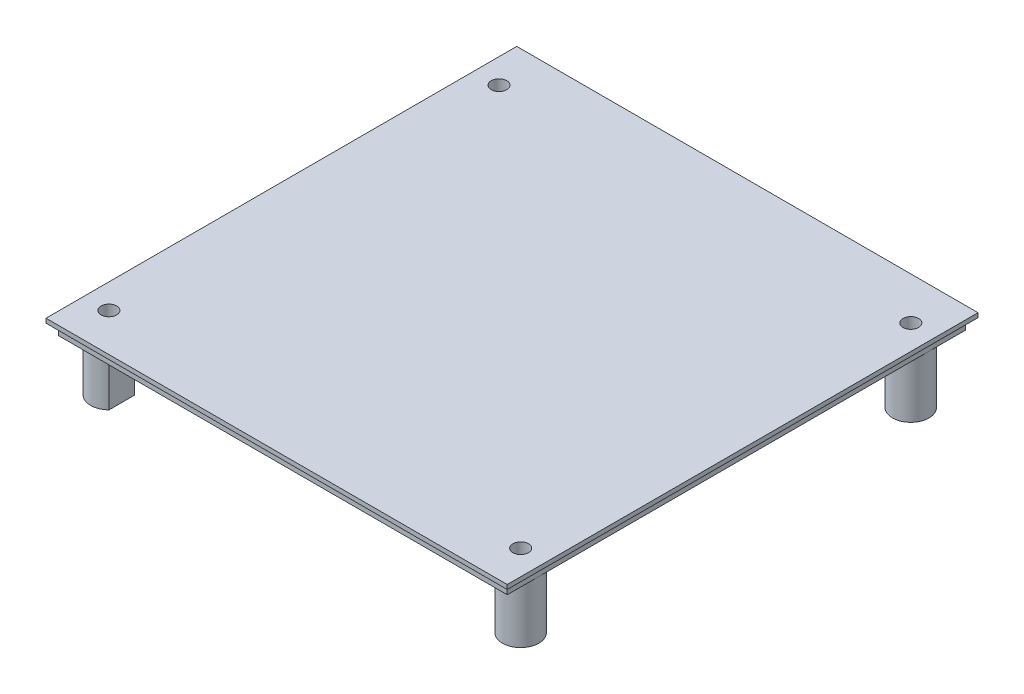
ISO-10303-21;
HEADER;
FILE_DESCRIPTION(('STEP AP214'),'2;1');
FILE_NAME('part.step','',(''),(''),'','','');
FILE_SCHEMA(('AUTOMOTIVE_DESIGN { 1 0 10303 214 1 1 1 1 }'));
ENDSEC;
DATA;
#1=APPLICATION_CONTEXT('core data for automotive mechanical design processes');
#2=APPLICATION_PROTOCOL_DEFINITION('international standard','automotive_design',2000,#1);
#3=PRODUCT_CONTEXT('',#1,'mechanical');
#4=PRODUCT('Part','Part','',(#3));
#5=PRODUCT_RELATED_PRODUCT_CATEGORY('part','',(#4));
#6=PRODUCT_DEFINITION_FORMATION('','',#4);
#7=PRODUCT_DEFINITION_CONTEXT('part definition',#1,'design');
#8=PRODUCT_DEFINITION('design','',#6,#7);
#9=PRODUCT_DEFINITION_SHAPE('','',#8);
#10=(LENGTH_UNIT() NAMED_UNIT(*) SI_UNIT(.MILLI.,.METRE.));
#11=(NAMED_UNIT(*) PLANE_ANGLE_UNIT() SI_UNIT($,.RADIAN.));
#12=(NAMED_UNIT(*) SI_UNIT($,.STERADIAN.) SOLID_ANGLE_UNIT());
#13=UNCERTAINTY_MEASURE_WITH_UNIT(LENGTH_MEASURE(1.E-05),#10,'distance_accuracy_value','');
#14=(GEOMETRIC_REPRESENTATION_CONTEXT(3) GLOBAL_UNCERTAINTY_ASSIGNED_CONTEXT((#13)) GLOBAL_UNIT_ASSIGNED_CONTEXT((#10,
#11,#12)) REPRESENTATION_CONTEXT('',''));
#15=CARTESIAN_POINT('',(0.,0.,0.));
#16=DIRECTION('',(0.,0.,1.));
#17=DIRECTION('',(1.,0.,0.));
#18=AXIS2_PLACEMENT_3D('',#15,#16,#17);
#19=CARTESIAN_POINT('',(0.,0.,0.));
#20=DIRECTION('',(0.,1.,0.));
#21=DIRECTION('',(0.,0.,1.));
#22=AXIS2_PLACEMENT_3D('',#19,#20,#21);
#23=PLANE('',#22);
#24=DIRECTION('',(0.,0.,-1.));
#25=VECTOR('',#24,1.);
#26=CARTESIAN_POINT('',(-44.5,0.,50.724603037412));
#27=LINE('',#26,#25);
#28=CARTESIAN_POINT('',(-44.5,0.,-41.5606123086612));
#29=VERTEX_POINT('',#28);
#30=CARTESIAN_POINT('',(-44.5,0.,-47.4393876913388));
#31=VERTEX_POINT('',#30);
#32=EDGE_CURVE('E445',#29,#31,#27,.T.);
#33=ORIENTED_EDGE('',*,*,#32,.T.);
#34=CARTESIAN_POINT('',(-47.500000000001,0.,-44.5));
#35=DIRECTION('',(0.,-1.,0.));
#36=DIRECTION('',(0.,0.,-1.));
#37=AXIS2_PLACEMENT_3D('',#34,#35,#36);
#38=CIRCLE('',#37,4.2);
#39=CARTESIAN_POINT('',(-51.05,0.,-46.744437568748));
#40=VERTEX_POINT('',#39);
#41=EDGE_CURVE('E268',#40,#31,#38,.T.);
#42=ORIENTED_EDGE('',*,*,#41,.F.);
#43=DIRECTION('',(0.,0.,-1.));
#44=VECTOR('',#43,1.);
#45=CARTESIAN_POINT('',(-51.05,0.,52.15));
#46=LINE('',#45,#44);
#47=CARTESIAN_POINT('',(-51.05,0.,-52.15));
#48=VERTEX_POINT('',#47);
#49=EDGE_CURVE('E343',#40,#48,#46,.T.);
#50=ORIENTED_EDGE('',*,*,#49,.T.);
#51=DIRECTION('',(1.,0.,0.));
#52=VECTOR('',#51,1.);
#53=CARTESIAN_POINT('',(-51.05,0.,-52.15));
#54=LINE('',#53,#52);
#55=CARTESIAN_POINT('',(51.05,0.,-52.15));
#56=VERTEX_POINT('',#55);
#57=EDGE_CURVE('E318',#48,#56,#54,.T.);
#58=ORIENTED_EDGE('',*,*,#57,.T.);
#59=DIRECTION('',(0.,0.,1.));
#60=VECTOR('',#59,1.);
#61=CARTESIAN_POINT('',(51.05,0.,-52.15));
#62=LINE('',#61,#60);
#63=CARTESIAN_POINT('',(51.05,0.,-46.7444375687459));
#64=VERTEX_POINT('',#63);
#65=EDGE_CURVE('E246',#56,#64,#62,.T.);
#66=ORIENTED_EDGE('',*,*,#65,.T.);
#67=CARTESIAN_POINT('',(47.4999999999997,0.,-44.5));
#68=DIRECTION('',(0.,-1.,0.));
#69=DIRECTION('',(0.,0.,-1.));
#70=AXIS2_PLACEMENT_3D('',#67,#68,#69);
#71=CIRCLE('',#70,4.2);
#72=CARTESIAN_POINT('',(44.5,0.,-47.4393876913401));
#73=VERTEX_POINT('',#72);
#74=EDGE_CURVE('E238',#73,#64,#71,.T.);
#75=ORIENTED_EDGE('',*,*,#74,.F.);
#76=DIRECTION('',(0.,0.,1.));
#77=VECTOR('',#76,1.);
#78=CARTESIAN_POINT('',(44.5,0.,50.724603037412));
#79=LINE('',#78,#77);
#80=CARTESIAN_POINT('',(44.5,0.,-41.5606123086599));
#81=VERTEX_POINT('',#80);
#82=EDGE_CURVE('E221',#73,#81,#79,.T.);
#83=ORIENTED_EDGE('',*,*,#82,.T.);
#84=CARTESIAN_POINT('',(51.05,0.,-42.2555624312541));
#85=VERTEX_POINT('',#84);
#86=EDGE_CURVE('E247',#85,#81,#71,.T.);
#87=ORIENTED_EDGE('',*,*,#86,.F.);
#88=CARTESIAN_POINT('',(51.05,0.,43.2555624312541));
#89=VERTEX_POINT('',#88);
#90=EDGE_CURVE('E340',#85,#89,#62,.T.);
#91=ORIENTED_EDGE('',*,*,#90,.T.);
#92=CARTESIAN_POINT('',(47.4999999999997,0.,45.5));
#93=DIRECTION('',(0.,-1.,0.));
#94=DIRECTION('',(0.,0.,-1.));
#95=AXIS2_PLACEMENT_3D('',#92,#93,#94);
#96=CIRCLE('',#95,4.2);
#97=CARTESIAN_POINT('',(44.5,0.,42.5606123086599));
#98=VERTEX_POINT('',#97);
#99=EDGE_CURVE('E279',#98,#89,#96,.T.);
#100=ORIENTED_EDGE('',*,*,#99,.F.);
#101=CARTESIAN_POINT('',(44.5,0.,48.4393876913401));
#102=VERTEX_POINT('',#101);
#103=EDGE_CURVE('E233',#98,#102,#79,.T.);
#104=ORIENTED_EDGE('',*,*,#103,.T.);
#105=CARTESIAN_POINT('',(51.05,0.,47.7444375687459));
#106=VERTEX_POINT('',#105);
#107=EDGE_CURVE('E284',#106,#102,#96,.T.);
#108=ORIENTED_EDGE('',*,*,#107,.F.);
#109=CARTESIAN_POINT('',(51.05,0.,52.15));
#110=VERTEX_POINT('',#109);
#111=EDGE_CURVE('E337',#106,#110,#62,.T.);
#112=ORIENTED_EDGE('',*,*,#111,.T.);
#113=DIRECTION('',(-1.,0.,0.));
#114=VECTOR('',#113,1.);
#115=CARTESIAN_POINT('',(51.05,0.,52.15));
#116=LINE('',#115,#114);
#117=CARTESIAN_POINT('',(-51.05,0.,52.15));
#118=VERTEX_POINT('',#117);
#119=EDGE_CURVE('E339',#110,#118,#116,.T.);
#120=ORIENTED_EDGE('',*,*,#119,.T.);
#121=CARTESIAN_POINT('',(-51.05,0.,47.744437568748));
#122=VERTEX_POINT('',#121);
#123=EDGE_CURVE('E322',#118,#122,#46,.T.);
#124=ORIENTED_EDGE('',*,*,#123,.T.);
#125=CARTESIAN_POINT('',(-47.500000000001,0.,45.5));
#126=DIRECTION('',(0.,-1.,0.));
#127=DIRECTION('',(0.,0.,-1.));
#128=AXIS2_PLACEMENT_3D('',#125,#126,#127);
#129=CIRCLE('',#128,4.2);
#130=CARTESIAN_POINT('',(-44.5,0.,48.4393876913387));
#131=VERTEX_POINT('',#130);
#132=EDGE_CURVE('E292',#131,#122,#129,.T.);
#133=ORIENTED_EDGE('',*,*,#132,.F.);
#134=CARTESIAN_POINT('',(-44.5,0.,42.5606123086612));
#135=VERTEX_POINT('',#134);
#136=EDGE_CURVE('E449',#131,#135,#27,.T.);
#137=ORIENTED_EDGE('',*,*,#136,.T.);
#138=CARTESIAN_POINT('',(-51.05,0.,43.255562431252));
#139=VERTEX_POINT('',#138);
#140=EDGE_CURVE('E297',#139,#135,#129,.T.);
#141=ORIENTED_EDGE('',*,*,#140,.F.);
#142=CARTESIAN_POINT('',(-51.05,0.,-42.255562431252));
#143=VERTEX_POINT('',#142);
#144=EDGE_CURVE('E346',#139,#143,#46,.T.);
#145=ORIENTED_EDGE('',*,*,#144,.T.);
#146=EDGE_CURVE('E263',#29,#143,#38,.T.);
#147=ORIENTED_EDGE('',*,*,#146,.F.);
#148=EDGE_LOOP('',(#33,#42,#50,#58,#66,#75,#83,#87,#91,#100,#104,#108,#112,#120,#124,#133,#137,
#141,#145,#147));
#149=FACE_BOUND('',#148,.T.);
#150=ADVANCED_FACE('F37',(#149),#23,.F.);
#151=CARTESIAN_POINT('',(51.05,-2.5,-52.15));
#152=DIRECTION('',(-1.,0.,0.));
#153=DIRECTION('',(0.,0.,1.));
#154=AXIS2_PLACEMENT_3D('',#151,#152,#153);
#155=PLANE('',#154);
#156=ORIENTED_EDGE('',*,*,#90,.F.);
#157=DIRECTION('',(0.,1.,0.));
#158=VECTOR('',#157,1.);
#159=CARTESIAN_POINT('',(51.05,-15.89,-42.2555624312541));
#160=LINE('',#159,#158);
#161=CARTESIAN_POINT('',(51.05,-2.5,-42.2555624312541));
#162=VERTEX_POINT('',#161);
#163=EDGE_CURVE('E257',#85,#162,#160,.F.);
#164=ORIENTED_EDGE('',*,*,#163,.T.);
#165=DIRECTION('',(0.,0.,1.));
#166=VECTOR('',#165,1.);
#167=CARTESIAN_POINT('',(51.05,-2.5,-52.15));
#168=LINE('',#167,#166);
#169=CARTESIAN_POINT('',(51.05,-2.5,43.2555624312541));
#170=VERTEX_POINT('',#169);
#171=EDGE_CURVE('E327',#162,#170,#168,.T.);
#172=ORIENTED_EDGE('',*,*,#171,.T.);
#173=DIRECTION('',(0.,1.,0.));
#174=VECTOR('',#173,1.);
#175=CARTESIAN_POINT('',(51.05,-15.89,43.2555624312541));
#176=LINE('',#175,#174);
#177=EDGE_CURVE('E420',#170,#89,#176,.T.);
#178=ORIENTED_EDGE('',*,*,#177,.T.);
#179=EDGE_LOOP('',(#156,#164,#172,#178));
#180=FACE_BOUND('',#179,.T.);
#181=ADVANCED_FACE('F508',(#180),#155,.T.);
#182=CARTESIAN_POINT('',(51.05,-2.5,-52.15));
#183=VERTEX_POINT('',#182);
#184=CARTESIAN_POINT('',(51.05,-2.5,-46.7444375687459));
#185=VERTEX_POINT('',#184);
#186=EDGE_CURVE('E323',#183,#185,#168,.T.);
#187=ORIENTED_EDGE('',*,*,#186,.T.);
#188=DIRECTION('',(0.,1.,0.));
#189=VECTOR('',#188,1.);
#190=CARTESIAN_POINT('',(51.05,-15.89,-46.7444375687459));
#191=LINE('',#190,#189);
#192=EDGE_CURVE('E255',#185,#64,#191,.T.);
#193=ORIENTED_EDGE('',*,*,#192,.T.);
#194=ORIENTED_EDGE('',*,*,#65,.F.);
#195=DIRECTION('',(0.,1.,0.));
#196=VECTOR('',#195,1.);
#197=CARTESIAN_POINT('',(51.05,-2.5,-52.15));
#198=LINE('',#197,#196);
#199=EDGE_CURVE('E354',#183,#56,#198,.T.);
#200=ORIENTED_EDGE('',*,*,#199,.F.);
#201=EDGE_LOOP('',(#187,#193,#194,#200));
#202=FACE_BOUND('',#201,.T.);
#203=ADVANCED_FACE('F490',(#202),#155,.T.);
#204=CARTESIAN_POINT('',(-51.05,-2.5,52.15));
#205=DIRECTION('',(1.,0.,0.));
#206=DIRECTION('',(0.,0.,-1.));
#207=AXIS2_PLACEMENT_3D('',#204,#205,#206);
#208=PLANE('',#207);
#209=ORIENTED_EDGE('',*,*,#49,.F.);
#210=DIRECTION('',(0.,1.,0.));
#211=VECTOR('',#210,1.);
#212=CARTESIAN_POINT('',(-51.05,-15.89,-46.744437568748));
#213=LINE('',#212,#211);
#214=CARTESIAN_POINT('',(-51.05,-2.5,-46.744437568748));
#215=VERTEX_POINT('',#214);
#216=EDGE_CURVE('E273',#40,#215,#213,.F.);
#217=ORIENTED_EDGE('',*,*,#216,.T.);
#218=DIRECTION('',(0.,0.,-1.));
#219=VECTOR('',#218,1.);
#220=CARTESIAN_POINT('',(-51.05,-2.5,52.15));
#221=LINE('',#220,#219);
#222=CARTESIAN_POINT('',(-51.05,-2.5,-52.15));
#223=VERTEX_POINT('',#222);
#224=EDGE_CURVE('E330',#215,#223,#221,.T.);
#225=ORIENTED_EDGE('',*,*,#224,.T.);
#226=DIRECTION('',(0.,1.,0.));
#227=VECTOR('',#226,1.);
#228=CARTESIAN_POINT('',(-51.05,-2.5,-52.15));
#229=LINE('',#228,#227);
#230=EDGE_CURVE('E334',#223,#48,#229,.T.);
#231=ORIENTED_EDGE('',*,*,#230,.T.);
#232=EDGE_LOOP('',(#209,#217,#225,#231));
#233=FACE_BOUND('',#232,.T.);
#234=ADVANCED_FACE('F482',(#233),#208,.T.);
#235=CARTESIAN_POINT('',(-51.05,-2.5,43.255562431252));
#236=VERTEX_POINT('',#235);
#237=CARTESIAN_POINT('',(-51.05,-2.5,-42.255562431252));
#238=VERTEX_POINT('',#237);
#239=EDGE_CURVE('E335',#236,#238,#221,.T.);
#240=ORIENTED_EDGE('',*,*,#239,.T.);
#241=DIRECTION('',(0.,1.,0.));
#242=VECTOR('',#241,1.);
#243=CARTESIAN_POINT('',(-51.05,-15.89,-42.255562431252));
#244=LINE('',#243,#242);
#245=EDGE_CURVE('E267',#238,#143,#244,.T.);
#246=ORIENTED_EDGE('',*,*,#245,.T.);
#247=ORIENTED_EDGE('',*,*,#144,.F.);
#248=DIRECTION('',(0.,1.,0.));
#249=VECTOR('',#248,1.);
#250=CARTESIAN_POINT('',(-51.05,-15.89,43.255562431252));
#251=LINE('',#250,#249);
#252=EDGE_CURVE('E304',#139,#236,#251,.F.);
#253=ORIENTED_EDGE('',*,*,#252,.T.);
#254=EDGE_LOOP('',(#240,#246,#247,#253));
#255=FACE_BOUND('',#254,.T.);
#256=ADVANCED_FACE('F494',(#255),#208,.T.);
#257=ORIENTED_EDGE('',*,*,#111,.F.);
#258=DIRECTION('',(0.,1.,0.));
#259=VECTOR('',#258,1.);
#260=CARTESIAN_POINT('',(51.05,-15.89,47.7444375687459));
#261=LINE('',#260,#259);
#262=CARTESIAN_POINT('',(51.05,-2.5,47.7444375687459));
#263=VERTEX_POINT('',#262);
#264=EDGE_CURVE('E423',#106,#263,#261,.F.);
#265=ORIENTED_EDGE('',*,*,#264,.T.);
#266=CARTESIAN_POINT('',(51.05,-2.5,52.15));
#267=VERTEX_POINT('',#266);
#268=EDGE_CURVE('E321',#263,#267,#168,.T.);
#269=ORIENTED_EDGE('',*,*,#268,.T.);
#270=DIRECTION('',(0.,1.,0.));
#271=VECTOR('',#270,1.);
#272=CARTESIAN_POINT('',(51.05,-2.5,52.15));
#273=LINE('',#272,#271);
#274=EDGE_CURVE('E351',#267,#110,#273,.T.);
#275=ORIENTED_EDGE('',*,*,#274,.T.);
#276=EDGE_LOOP('',(#257,#265,#269,#275));
#277=FACE_BOUND('',#276,.T.);
#278=ADVANCED_FACE('F516',(#277),#155,.T.);
#279=CARTESIAN_POINT('',(-51.05,-2.5,52.15));
#280=VERTEX_POINT('',#279);
#281=CARTESIAN_POINT('',(-51.05,-2.5,47.744437568748));
#282=VERTEX_POINT('',#281);
#283=EDGE_CURVE('E331',#280,#282,#221,.T.);
#284=ORIENTED_EDGE('',*,*,#283,.T.);
#285=DIRECTION('',(0.,1.,0.));
#286=VECTOR('',#285,1.);
#287=CARTESIAN_POINT('',(-51.05,-15.89,47.744437568748));
#288=LINE('',#287,#286);
#289=EDGE_CURVE('E296',#282,#122,#288,.T.);
#290=ORIENTED_EDGE('',*,*,#289,.T.);
#291=ORIENTED_EDGE('',*,*,#123,.F.);
#292=DIRECTION('',(0.,1.,0.));
#293=VECTOR('',#292,1.);
#294=CARTESIAN_POINT('',(-51.05,-2.5,52.15));
#295=LINE('',#294,#293);
#296=EDGE_CURVE('E349',#280,#118,#295,.T.);
#297=ORIENTED_EDGE('',*,*,#296,.F.);
#298=EDGE_LOOP('',(#284,#290,#291,#297));
#299=FACE_BOUND('',#298,.T.);
#300=ADVANCED_FACE('F467',(#299),#208,.T.);
#301=DIRECTION('',(0.,0.,-1.));
#302=VECTOR('',#301,1.);
#303=CARTESIAN_POINT('',(53.2,0.,-54.3));
#304=LINE('',#303,#302);
#305=CARTESIAN_POINT('',(53.2,0.,54.3));
#306=VERTEX_POINT('',#305);
#307=CARTESIAN_POINT('',(53.2,0.,-54.3));
#308=VERTEX_POINT('',#307);
#309=EDGE_CURVE('E390',#306,#308,#304,.T.);
#310=ORIENTED_EDGE('',*,*,#309,.F.);
#311=DIRECTION('',(1.,0.,0.));
#312=VECTOR('',#311,1.);
#313=CARTESIAN_POINT('',(-53.2,0.,54.3));
#314=LINE('',#313,#312);
#315=CARTESIAN_POINT('',(-53.2,0.,54.3));
#316=VERTEX_POINT('',#315);
#317=EDGE_CURVE('E395',#316,#306,#314,.T.);
#318=ORIENTED_EDGE('',*,*,#317,.F.);
#319=DIRECTION('',(0.,0.,1.));
#320=VECTOR('',#319,1.);
#321=CARTESIAN_POINT('',(-53.2,0.,-54.3));
#322=LINE('',#321,#320);
#323=CARTESIAN_POINT('',(-53.2,0.,-54.3));
#324=VERTEX_POINT('',#323);
#325=EDGE_CURVE('E406',#324,#316,#322,.T.);
#326=ORIENTED_EDGE('',*,*,#325,.F.);
#327=DIRECTION('',(-1.,0.,0.));
#328=VECTOR('',#327,1.);
#329=CARTESIAN_POINT('',(-53.2,0.,-54.3));
#330=LINE('',#329,#328);
#331=EDGE_CURVE('E404',#308,#324,#330,.T.);
#332=ORIENTED_EDGE('',*,*,#331,.F.);
#333=EDGE_LOOP('',(#310,#318,#326,#332));
#334=FACE_BOUND('',#333,.T.);
#335=DIRECTION('',(1.,0.,0.));
#336=VECTOR('',#335,1.);
#337=CARTESIAN_POINT('',(-51.75,0.,-52.85));
#338=LINE('',#337,#336);
#339=CARTESIAN_POINT('',(-51.75,0.,-52.85));
#340=VERTEX_POINT('',#339);
#341=CARTESIAN_POINT('',(51.75,0.,-52.85));
#342=VERTEX_POINT('',#341);
#343=EDGE_CURVE('E357',#340,#342,#338,.T.);
#344=ORIENTED_EDGE('',*,*,#343,.F.);
#345=DIRECTION('',(0.,0.,-1.));
#346=VECTOR('',#345,1.);
#347=CARTESIAN_POINT('',(-51.75,0.,52.85));
#348=LINE('',#347,#346);
#349=CARTESIAN_POINT('',(-51.75,0.,52.85));
#350=VERTEX_POINT('',#349);
#351=EDGE_CURVE('E362',#350,#340,#348,.T.);
#352=ORIENTED_EDGE('',*,*,#351,.F.);
#353=DIRECTION('',(-1.,0.,0.));
#354=VECTOR('',#353,1.);
#355=CARTESIAN_POINT('',(51.75,0.,52.85));
#356=LINE('',#355,#354);
#357=CARTESIAN_POINT('',(51.75,0.,52.85));
#358=VERTEX_POINT('',#357);
#359=EDGE_CURVE('E374',#358,#350,#356,.T.);
#360=ORIENTED_EDGE('',*,*,#359,.F.);
#361=DIRECTION('',(0.,0.,1.));
#362=VECTOR('',#361,1.);
#363=CARTESIAN_POINT('',(51.75,0.,-52.85));
#364=LINE('',#363,#362);
#365=EDGE_CURVE('E371',#342,#358,#364,.T.);
#366=ORIENTED_EDGE('',*,*,#365,.F.);
#367=EDGE_LOOP('',(#344,#352,#360,#366));
#368=FACE_BOUND('',#367,.T.);
#369=ADVANCED_FACE('F510',(#334,#368),#23,.F.);
#370=CARTESIAN_POINT('',(53.2,1.,-54.3));
#371=DIRECTION('',(-1.,0.,0.));
#372=DIRECTION('',(0.,0.,1.));
#373=AXIS2_PLACEMENT_3D('',#370,#371,#372);
#374=PLANE('',#373);
#375=ORIENTED_EDGE('',*,*,#309,.T.);
#376=DIRECTION('',(0.,-1.,0.));
#377=VECTOR('',#376,1.);
#378=CARTESIAN_POINT('',(53.2,1.,-54.3));
#379=LINE('',#378,#377);
#380=CARTESIAN_POINT('',(53.2,1.,-54.3));
#381=VERTEX_POINT('',#380);
#382=EDGE_CURVE('E417',#381,#308,#379,.T.);
#383=ORIENTED_EDGE('',*,*,#382,.F.);
#384=DIRECTION('',(0.,0.,-1.));
#385=VECTOR('',#384,1.);
#386=CARTESIAN_POINT('',(53.2,1.,-54.3));
#387=LINE('',#386,#385);
#388=CARTESIAN_POINT('',(53.2,1.,54.3));
#389=VERTEX_POINT('',#388);
#390=EDGE_CURVE('E391',#389,#381,#387,.T.);
#391=ORIENTED_EDGE('',*,*,#390,.F.);
#392=DIRECTION('',(0.,-1.,0.));
#393=VECTOR('',#392,1.);
#394=CARTESIAN_POINT('',(53.2,1.,54.3));
#395=LINE('',#394,#393);
#396=EDGE_CURVE('E401',#389,#306,#395,.T.);
#397=ORIENTED_EDGE('',*,*,#396,.T.);
#398=EDGE_LOOP('',(#375,#383,#391,#397));
#399=FACE_BOUND('',#398,.T.);
#400=ADVANCED_FACE('F39',(#399),#374,.F.);
#401=CARTESIAN_POINT('',(-53.2,1.,-54.3));
#402=DIRECTION('',(0.,0.,1.));
#403=DIRECTION('',(1.,0.,0.));
#404=AXIS2_PLACEMENT_3D('',#401,#402,#403);
#405=PLANE('',#404);
#406=ORIENTED_EDGE('',*,*,#331,.T.);
#407=DIRECTION('',(0.,-1.,0.));
#408=VECTOR('',#407,1.);
#409=CARTESIAN_POINT('',(-53.2,1.,-54.3));
#410=LINE('',#409,#408);
#411=CARTESIAN_POINT('',(-53.2,1.,-54.3));
#412=VERTEX_POINT('',#411);
#413=EDGE_CURVE('E414',#412,#324,#410,.T.);
#414=ORIENTED_EDGE('',*,*,#413,.F.);
#415=DIRECTION('',(-1.,0.,0.));
#416=VECTOR('',#415,1.);
#417=CARTESIAN_POINT('',(-53.2,1.,-54.3));
#418=LINE('',#417,#416);
#419=EDGE_CURVE('E394',#381,#412,#418,.T.);
#420=ORIENTED_EDGE('',*,*,#419,.F.);
#421=ORIENTED_EDGE('',*,*,#382,.T.);
#422=EDGE_LOOP('',(#406,#414,#420,#421));
#423=FACE_BOUND('',#422,.T.);
#424=ADVANCED_FACE('F525',(#423),#405,.F.);
#425=CARTESIAN_POINT('',(-53.2,1.,-54.3));
#426=DIRECTION('',(1.,0.,0.));
#427=DIRECTION('',(0.,0.,-1.));
#428=AXIS2_PLACEMENT_3D('',#425,#426,#427);
#429=PLANE('',#428);
#430=ORIENTED_EDGE('',*,*,#325,.T.);
#431=DIRECTION('',(0.,-1.,0.));
#432=VECTOR('',#431,1.);
#433=CARTESIAN_POINT('',(-53.2,1.,54.3));
#434=LINE('',#433,#432);
#435=CARTESIAN_POINT('',(-53.2,1.,54.3));
#436=VERTEX_POINT('',#435);
#437=EDGE_CURVE('E411',#436,#316,#434,.T.);
#438=ORIENTED_EDGE('',*,*,#437,.F.);
#439=DIRECTION('',(0.,0.,1.));
#440=VECTOR('',#439,1.);
#441=CARTESIAN_POINT('',(-53.2,1.,-54.3));
#442=LINE('',#441,#440);
#443=EDGE_CURVE('E397',#412,#436,#442,.T.);
#444=ORIENTED_EDGE('',*,*,#443,.F.);
#445=ORIENTED_EDGE('',*,*,#413,.T.);
#446=EDGE_LOOP('',(#430,#438,#444,#445));
#447=FACE_BOUND('',#446,.T.);
#448=ADVANCED_FACE('F565',(#447),#429,.F.);
#449=CARTESIAN_POINT('',(-53.2,1.,54.3));
#450=DIRECTION('',(0.,0.,-1.));
#451=DIRECTION('',(-1.,0.,0.));
#452=AXIS2_PLACEMENT_3D('',#449,#450,#451);
#453=PLANE('',#452);
#454=ORIENTED_EDGE('',*,*,#317,.T.);
#455=ORIENTED_EDGE('',*,*,#396,.F.);
#456=DIRECTION('',(1.,0.,0.));
#457=VECTOR('',#456,1.);
#458=CARTESIAN_POINT('',(-53.2,1.,54.3));
#459=LINE('',#458,#457);
#460=EDGE_CURVE('E399',#436,#389,#459,.T.);
#461=ORIENTED_EDGE('',*,*,#460,.F.);
#462=ORIENTED_EDGE('',*,*,#437,.T.);
#463=EDGE_LOOP('',(#454,#455,#461,#462));
#464=FACE_BOUND('',#463,.T.);
#465=ADVANCED_FACE('F558',(#464),#453,.F.);
#466=CARTESIAN_POINT('',(0.,1.,0.));
#467=DIRECTION('',(0.,1.,0.));
#468=DIRECTION('',(0.,0.,1.));
#469=AXIS2_PLACEMENT_3D('',#466,#467,#468);
#470=PLANE('',#469);
#471=CARTESIAN_POINT('',(47.4999999999997,1.,45.5));
#472=DIRECTION('',(0.,1.,0.));
#473=DIRECTION('',(0.,0.,1.));
#474=AXIS2_PLACEMENT_3D('',#471,#472,#473);
#475=CIRCLE('',#474,1.8);
#476=CARTESIAN_POINT('',(47.4999999999997,1.,47.3));
#477=VERTEX_POINT('',#476);
#478=EDGE_CURVE('E306',#477,#477,#475,.T.);
#479=ORIENTED_EDGE('',*,*,#478,.F.);
#480=EDGE_LOOP('',(#479));
#481=FACE_BOUND('',#480,.T.);
#482=CARTESIAN_POINT('',(-47.500000000001,1.,45.5));
#483=DIRECTION('',(0.,1.,0.));
#484=DIRECTION('',(0.,0.,1.));
#485=AXIS2_PLACEMENT_3D('',#482,#483,#484);
#486=CIRCLE('',#485,1.79999999999996);
#487=CARTESIAN_POINT('',(-47.500000000001,1.,47.2999999999999));
#488=VERTEX_POINT('',#487);
#489=EDGE_CURVE('E311',#488,#488,#486,.T.);
#490=ORIENTED_EDGE('',*,*,#489,.F.);
#491=EDGE_LOOP('',(#490));
#492=FACE_BOUND('',#491,.T.);
#493=CARTESIAN_POINT('',(-47.500000000001,1.,-44.5));
#494=DIRECTION('',(0.,1.,0.));
#495=DIRECTION('',(0.,0.,1.));
#496=AXIS2_PLACEMENT_3D('',#493,#494,#495);
#497=CIRCLE('',#496,1.79999999999999);
#498=CARTESIAN_POINT('',(-47.500000000001,1.,-42.7));
#499=VERTEX_POINT('',#498);
#500=EDGE_CURVE('E307',#499,#499,#497,.T.);
#501=ORIENTED_EDGE('',*,*,#500,.F.);
#502=EDGE_LOOP('',(#501));
#503=FACE_BOUND('',#502,.T.);
#504=CARTESIAN_POINT('',(47.4999999999997,1.,-44.5));
#505=DIRECTION('',(0.,1.,0.));
#506=DIRECTION('',(0.,0.,1.));
#507=AXIS2_PLACEMENT_3D('',#504,#505,#506);
#508=CIRCLE('',#507,1.8);
#509=CARTESIAN_POINT('',(47.4999999999997,1.,-42.7));
#510=VERTEX_POINT('',#509);
#511=EDGE_CURVE('E310',#510,#510,#508,.T.);
#512=ORIENTED_EDGE('',*,*,#511,.F.);
#513=EDGE_LOOP('',(#512));
#514=FACE_BOUND('',#513,.T.);
#515=ORIENTED_EDGE('',*,*,#390,.T.);
#516=ORIENTED_EDGE('',*,*,#419,.T.);
#517=ORIENTED_EDGE('',*,*,#443,.T.);
#518=ORIENTED_EDGE('',*,*,#460,.T.);
#519=EDGE_LOOP('',(#515,#516,#517,#518));
#520=FACE_BOUND('',#519,.T.);
#521=ADVANCED_FACE('F556',(#481,#492,#503,#514,#520),#470,.T.);
#522=CARTESIAN_POINT('',(0.,-2.5,0.));
#523=DIRECTION('',(0.,-1.,0.));
#524=DIRECTION('',(0.,0.,-1.));
#525=AXIS2_PLACEMENT_3D('',#522,#523,#524);
#526=PLANE('',#525);
#527=DIRECTION('',(1.,0.,0.));
#528=VECTOR('',#527,1.);
#529=CARTESIAN_POINT('',(-51.75,-2.5,-52.85));
#530=LINE('',#529,#528);
#531=CARTESIAN_POINT('',(-51.75,-2.5,-52.85));
#532=VERTEX_POINT('',#531);
#533=CARTESIAN_POINT('',(51.75,-2.5,-52.85));
#534=VERTEX_POINT('',#533);
#535=EDGE_CURVE('E358',#532,#534,#530,.T.);
#536=ORIENTED_EDGE('',*,*,#535,.T.);
#537=DIRECTION('',(0.,0.,1.));
#538=VECTOR('',#537,1.);
#539=CARTESIAN_POINT('',(51.75,-2.5,-52.85));
#540=LINE('',#539,#538);
#541=CARTESIAN_POINT('',(51.75,-2.5,52.85));
#542=VERTEX_POINT('',#541);
#543=EDGE_CURVE('E361',#534,#542,#540,.T.);
#544=ORIENTED_EDGE('',*,*,#543,.T.);
#545=DIRECTION('',(-1.,0.,0.));
#546=VECTOR('',#545,1.);
#547=CARTESIAN_POINT('',(51.75,-2.5,52.85));
#548=LINE('',#547,#546);
#549=CARTESIAN_POINT('',(-51.75,-2.5,52.85));
#550=VERTEX_POINT('',#549);
#551=EDGE_CURVE('E364',#542,#550,#548,.T.);
#552=ORIENTED_EDGE('',*,*,#551,.T.);
#553=DIRECTION('',(0.,0.,-1.));
#554=VECTOR('',#553,1.);
#555=CARTESIAN_POINT('',(-51.75,-2.5,52.85));
#556=LINE('',#555,#554);
#557=EDGE_CURVE('E366',#550,#532,#556,.T.);
#558=ORIENTED_EDGE('',*,*,#557,.T.);
#559=EDGE_LOOP('',(#536,#544,#552,#558));
#560=FACE_BOUND('',#559,.T.);
#561=ORIENTED_EDGE('',*,*,#171,.F.);
#562=CARTESIAN_POINT('',(47.4999999999997,-2.5,-44.5));
#563=DIRECTION('',(0.,-1.,0.));
#564=DIRECTION('',(0.,0.,-1.));
#565=AXIS2_PLACEMENT_3D('',#562,#563,#564);
#566=CIRCLE('',#565,4.2);
#567=EDGE_CURVE('E429',#162,#185,#566,.F.);
#568=ORIENTED_EDGE('',*,*,#567,.T.);
#569=ORIENTED_EDGE('',*,*,#186,.F.);
#570=DIRECTION('',(1.,0.,0.));
#571=VECTOR('',#570,1.);
#572=CARTESIAN_POINT('',(-51.05,-2.5,-52.15));
#573=LINE('',#572,#571);
#574=EDGE_CURVE('E319',#223,#183,#573,.T.);
#575=ORIENTED_EDGE('',*,*,#574,.F.);
#576=ORIENTED_EDGE('',*,*,#224,.F.);
#577=CARTESIAN_POINT('',(-47.500000000001,-2.5,-44.5));
#578=DIRECTION('',(0.,-1.,0.));
#579=DIRECTION('',(0.,0.,-1.));
#580=AXIS2_PLACEMENT_3D('',#577,#578,#579);
#581=CIRCLE('',#580,4.2);
#582=EDGE_CURVE('E426',#215,#238,#581,.F.);
#583=ORIENTED_EDGE('',*,*,#582,.T.);
#584=ORIENTED_EDGE('',*,*,#239,.F.);
#585=CARTESIAN_POINT('',(-47.500000000001,-2.5,45.5));
#586=DIRECTION('',(0.,-1.,0.));
#587=DIRECTION('',(0.,0.,-1.));
#588=AXIS2_PLACEMENT_3D('',#585,#586,#587);
#589=CIRCLE('',#588,4.2);
#590=EDGE_CURVE('E302',#236,#282,#589,.F.);
#591=ORIENTED_EDGE('',*,*,#590,.T.);
#592=ORIENTED_EDGE('',*,*,#283,.F.);
#593=DIRECTION('',(-1.,0.,0.));
#594=VECTOR('',#593,1.);
#595=CARTESIAN_POINT('',(51.05,-2.5,52.15));
#596=LINE('',#595,#594);
#597=EDGE_CURVE('E326',#267,#280,#596,.T.);
#598=ORIENTED_EDGE('',*,*,#597,.F.);
#599=ORIENTED_EDGE('',*,*,#268,.F.);
#600=CARTESIAN_POINT('',(47.4999999999997,-2.5,45.5));
#601=DIRECTION('',(0.,-1.,0.));
#602=DIRECTION('',(0.,0.,-1.));
#603=AXIS2_PLACEMENT_3D('',#600,#601,#602);
#604=CIRCLE('',#603,4.2);
#605=EDGE_CURVE('E283',#263,#170,#604,.F.);
#606=ORIENTED_EDGE('',*,*,#605,.T.);
#607=EDGE_LOOP('',(#561,#568,#569,#575,#576,#583,#584,#591,#592,#598,#599,#606));
#608=FACE_BOUND('',#607,.T.);
#609=ADVANCED_FACE('F474',(#560,#608),#526,.T.);
#610=CARTESIAN_POINT('',(-51.75,-2.5,-52.85));
#611=DIRECTION('',(0.,0.,1.));
#612=DIRECTION('',(1.,0.,0.));
#613=AXIS2_PLACEMENT_3D('',#610,#611,#612);
#614=PLANE('',#613);
#615=ORIENTED_EDGE('',*,*,#343,.T.);
#616=DIRECTION('',(0.,1.,0.));
#617=VECTOR('',#616,1.);
#618=CARTESIAN_POINT('',(51.75,-2.5,-52.85));
#619=LINE('',#618,#617);
#620=EDGE_CURVE('E387',#534,#342,#619,.T.);
#621=ORIENTED_EDGE('',*,*,#620,.F.);
#622=ORIENTED_EDGE('',*,*,#535,.F.);
#623=DIRECTION('',(0.,1.,0.));
#624=VECTOR('',#623,1.);
#625=CARTESIAN_POINT('',(-51.75,-2.5,-52.85));
#626=LINE('',#625,#624);
#627=EDGE_CURVE('E368',#532,#340,#626,.T.);
#628=ORIENTED_EDGE('',*,*,#627,.T.);
#629=EDGE_LOOP('',(#615,#621,#622,#628));
#630=FACE_BOUND('',#629,.T.);
#631=ADVANCED_FACE('F539',(#630),#614,.F.);
#632=CARTESIAN_POINT('',(51.75,-2.5,-52.85));
#633=DIRECTION('',(-1.,0.,0.));
#634=DIRECTION('',(0.,0.,1.));
#635=AXIS2_PLACEMENT_3D('',#632,#633,#634);
#636=PLANE('',#635);
#637=ORIENTED_EDGE('',*,*,#365,.T.);
#638=DIRECTION('',(0.,1.,0.));
#639=VECTOR('',#638,1.);
#640=CARTESIAN_POINT('',(51.75,-2.5,52.85));
#641=LINE('',#640,#639);
#642=EDGE_CURVE('E384',#542,#358,#641,.T.);
#643=ORIENTED_EDGE('',*,*,#642,.F.);
#644=ORIENTED_EDGE('',*,*,#543,.F.);
#645=ORIENTED_EDGE('',*,*,#620,.T.);
#646=EDGE_LOOP('',(#637,#643,#644,#645));
#647=FACE_BOUND('',#646,.T.);
#648=ADVANCED_FACE('F546',(#647),#636,.F.);
#649=CARTESIAN_POINT('',(51.75,-2.5,52.85));
#650=DIRECTION('',(0.,0.,-1.));
#651=DIRECTION('',(-1.,0.,0.));
#652=AXIS2_PLACEMENT_3D('',#649,#650,#651);
#653=PLANE('',#652);
#654=ORIENTED_EDGE('',*,*,#359,.T.);
#655=DIRECTION('',(0.,1.,0.));
#656=VECTOR('',#655,1.);
#657=CARTESIAN_POINT('',(-51.75,-2.5,52.85));
#658=LINE('',#657,#656);
#659=EDGE_CURVE('E381',#550,#350,#658,.T.);
#660=ORIENTED_EDGE('',*,*,#659,.F.);
#661=ORIENTED_EDGE('',*,*,#551,.F.);
#662=ORIENTED_EDGE('',*,*,#642,.T.);
#663=EDGE_LOOP('',(#654,#660,#661,#662));
#664=FACE_BOUND('',#663,.T.);
#665=ADVANCED_FACE('F544',(#664),#653,.F.);
#666=CARTESIAN_POINT('',(-51.75,-2.5,52.85));
#667=DIRECTION('',(1.,0.,0.));
#668=DIRECTION('',(0.,0.,-1.));
#669=AXIS2_PLACEMENT_3D('',#666,#667,#668);
#670=PLANE('',#669);
#671=ORIENTED_EDGE('',*,*,#351,.T.);
#672=ORIENTED_EDGE('',*,*,#627,.F.);
#673=ORIENTED_EDGE('',*,*,#557,.F.);
#674=ORIENTED_EDGE('',*,*,#659,.T.);
#675=EDGE_LOOP('',(#671,#672,#673,#674));
#676=FACE_BOUND('',#675,.T.);
#677=ADVANCED_FACE('F535',(#676),#670,.F.);
#678=CARTESIAN_POINT('',(-51.05,-2.5,-52.15));
#679=DIRECTION('',(0.,0.,1.));
#680=DIRECTION('',(1.,0.,0.));
#681=AXIS2_PLACEMENT_3D('',#678,#679,#680);
#682=PLANE('',#681);
#683=ORIENTED_EDGE('',*,*,#57,.F.);
#684=ORIENTED_EDGE('',*,*,#230,.F.);
#685=ORIENTED_EDGE('',*,*,#574,.T.);
#686=ORIENTED_EDGE('',*,*,#199,.T.);
#687=EDGE_LOOP('',(#683,#684,#685,#686));
#688=FACE_BOUND('',#687,.T.);
#689=ADVANCED_FACE('F486',(#688),#682,.T.);
#690=CARTESIAN_POINT('',(51.05,-2.5,52.15));
#691=DIRECTION('',(0.,0.,-1.));
#692=DIRECTION('',(-1.,0.,0.));
#693=AXIS2_PLACEMENT_3D('',#690,#691,#692);
#694=PLANE('',#693);
#695=ORIENTED_EDGE('',*,*,#119,.F.);
#696=ORIENTED_EDGE('',*,*,#274,.F.);
#697=ORIENTED_EDGE('',*,*,#597,.T.);
#698=ORIENTED_EDGE('',*,*,#296,.T.);
#699=EDGE_LOOP('',(#695,#696,#697,#698));
#700=FACE_BOUND('',#699,.T.);
#701=ADVANCED_FACE('F654',(#700),#694,.T.);
#702=CARTESIAN_POINT('',(47.4999999999997,-2.5,-44.5));
#703=DIRECTION('',(0.,1.,0.));
#704=DIRECTION('',(0.,0.,1.));
#705=AXIS2_PLACEMENT_3D('',#702,#703,#704);
#706=CYLINDRICAL_SURFACE('',#705,1.8);
#707=ORIENTED_EDGE('',*,*,#511,.T.);
#708=EDGE_LOOP('',(#707));
#709=FACE_BOUND('',#708,.T.);
#710=CARTESIAN_POINT('',(47.4999999999997,-15.89,-44.5));
#711=DIRECTION('',(0.,-1.,0.));
#712=DIRECTION('',(0.,0.,-1.));
#713=AXIS2_PLACEMENT_3D('',#710,#711,#712);
#714=CIRCLE('',#713,1.8);
#715=CARTESIAN_POINT('',(47.4999999999997,-15.89,-46.3));
#716=VERTEX_POINT('',#715);
#717=EDGE_CURVE('E248',#716,#716,#714,.T.);
#718=ORIENTED_EDGE('',*,*,#717,.T.);
#719=EDGE_LOOP('',(#718));
#720=FACE_BOUND('',#719,.T.);
#721=ADVANCED_FACE('F661',(#709,#720),#706,.F.);
#722=CARTESIAN_POINT('',(-47.500000000001,-2.5,-44.5));
#723=DIRECTION('',(0.,1.,0.));
#724=DIRECTION('',(0.,0.,1.));
#725=AXIS2_PLACEMENT_3D('',#722,#723,#724);
#726=CYLINDRICAL_SURFACE('',#725,1.79999999999999);
#727=ORIENTED_EDGE('',*,*,#500,.T.);
#728=EDGE_LOOP('',(#727));
#729=FACE_BOUND('',#728,.T.);
#730=CARTESIAN_POINT('',(-47.500000000001,-15.89,-44.5));
#731=DIRECTION('',(0.,-1.,0.));
#732=DIRECTION('',(0.,0.,-1.));
#733=AXIS2_PLACEMENT_3D('',#730,#731,#732);
#734=CIRCLE('',#733,1.79999999999999);
#735=CARTESIAN_POINT('',(-47.500000000001,-15.89,-46.3));
#736=VERTEX_POINT('',#735);
#737=EDGE_CURVE('E260',#736,#736,#734,.T.);
#738=ORIENTED_EDGE('',*,*,#737,.T.);
#739=EDGE_LOOP('',(#738));
#740=FACE_BOUND('',#739,.T.);
#741=ADVANCED_FACE('F671',(#729,#740),#726,.F.);
#742=CARTESIAN_POINT('',(-47.500000000001,-2.5,45.5));
#743=DIRECTION('',(0.,1.,0.));
#744=DIRECTION('',(0.,0.,1.));
#745=AXIS2_PLACEMENT_3D('',#742,#743,#744);
#746=CYLINDRICAL_SURFACE('',#745,1.79999999999996);
#747=ORIENTED_EDGE('',*,*,#489,.T.);
#748=EDGE_LOOP('',(#747));
#749=FACE_BOUND('',#748,.T.);
#750=CARTESIAN_POINT('',(-47.500000000001,-15.89,45.5));
#751=DIRECTION('',(0.,-1.,0.));
#752=DIRECTION('',(0.,0.,-1.));
#753=AXIS2_PLACEMENT_3D('',#750,#751,#752);
#754=CIRCLE('',#753,1.79999999999996);
#755=CARTESIAN_POINT('',(-47.500000000001,-15.89,43.7));
#756=VERTEX_POINT('',#755);
#757=EDGE_CURVE('E289',#756,#756,#754,.T.);
#758=ORIENTED_EDGE('',*,*,#757,.T.);
#759=EDGE_LOOP('',(#758));
#760=FACE_BOUND('',#759,.T.);
#761=ADVANCED_FACE('F684',(#749,#760),#746,.F.);
#762=CARTESIAN_POINT('',(47.4999999999997,-2.5,45.5));
#763=DIRECTION('',(0.,1.,0.));
#764=DIRECTION('',(0.,0.,1.));
#765=AXIS2_PLACEMENT_3D('',#762,#763,#764);
#766=CYLINDRICAL_SURFACE('',#765,1.8);
#767=ORIENTED_EDGE('',*,*,#478,.T.);
#768=EDGE_LOOP('',(#767));
#769=FACE_BOUND('',#768,.T.);
#770=CARTESIAN_POINT('',(47.4999999999997,-15.89,45.5));
#771=DIRECTION('',(0.,-1.,0.));
#772=DIRECTION('',(0.,0.,-1.));
#773=AXIS2_PLACEMENT_3D('',#770,#771,#772);
#774=CIRCLE('',#773,1.8);
#775=CARTESIAN_POINT('',(47.4999999999997,-15.89,43.7));
#776=VERTEX_POINT('',#775);
#777=EDGE_CURVE('E276',#776,#776,#774,.T.);
#778=ORIENTED_EDGE('',*,*,#777,.T.);
#779=EDGE_LOOP('',(#778));
#780=FACE_BOUND('',#779,.T.);
#781=ADVANCED_FACE('F697',(#769,#780),#766,.F.);
#782=CARTESIAN_POINT('',(-47.500000000001,-15.89,45.5));
#783=DIRECTION('',(0.,-1.,0.));
#784=DIRECTION('',(0.,0.,-1.));
#785=AXIS2_PLACEMENT_3D('',#782,#783,#784);
#786=PLANE('',#785);
#787=DIRECTION('',(0.,0.,-1.));
#788=VECTOR('',#787,1.);
#789=CARTESIAN_POINT('',(-44.5,-15.89,50.724603037412));
#790=LINE('',#789,#788);
#791=CARTESIAN_POINT('',(-44.5,-15.89,48.4393876913387));
#792=VERTEX_POINT('',#791);
#793=CARTESIAN_POINT('',(-44.5,-15.89,42.5606123086612));
#794=VERTEX_POINT('',#793);
#795=EDGE_CURVE('E52',#792,#794,#790,.T.);
#796=ORIENTED_EDGE('',*,*,#795,.F.);
#797=CARTESIAN_POINT('',(-47.500000000001,-15.89,45.5));
#798=DIRECTION('',(0.,-1.,0.));
#799=DIRECTION('',(0.,0.,-1.));
#800=AXIS2_PLACEMENT_3D('',#797,#798,#799);
#801=CIRCLE('',#800,4.2);
#802=EDGE_CURVE('E293',#792,#794,#801,.T.);
#803=ORIENTED_EDGE('',*,*,#802,.T.);
#804=EDGE_LOOP('',(#796,#803));
#805=FACE_BOUND('',#804,.T.);
#806=ORIENTED_EDGE('',*,*,#757,.F.);
#807=EDGE_LOOP('',(#806));
#808=FACE_BOUND('',#807,.T.);
#809=ADVANCED_FACE('F710',(#805,#808),#786,.T.);
#810=CARTESIAN_POINT('',(-47.500000000001,-15.89,45.5));
#811=DIRECTION('',(0.,1.,0.));
#812=DIRECTION('',(0.,0.,1.));
#813=AXIS2_PLACEMENT_3D('',#810,#811,#812);
#814=CYLINDRICAL_SURFACE('',#813,4.2);
#815=ORIENTED_EDGE('',*,*,#802,.F.);
#816=DIRECTION('',(0.,1.,0.));
#817=VECTOR('',#816,1.);
#818=CARTESIAN_POINT('',(-44.5,-15.89,48.4393876913387));
#819=LINE('',#818,#817);
#820=EDGE_CURVE('E251',#792,#131,#819,.T.);
#821=ORIENTED_EDGE('',*,*,#820,.T.);
#822=ORIENTED_EDGE('',*,*,#132,.T.);
#823=ORIENTED_EDGE('',*,*,#289,.F.);
#824=ORIENTED_EDGE('',*,*,#590,.F.);
#825=ORIENTED_EDGE('',*,*,#252,.F.);
#826=ORIENTED_EDGE('',*,*,#140,.T.);
#827=DIRECTION('',(0.,1.,0.));
#828=VECTOR('',#827,1.);
#829=CARTESIAN_POINT('',(-44.5,-15.89,42.5606123086612));
#830=LINE('',#829,#828);
#831=EDGE_CURVE('E455',#135,#794,#830,.F.);
#832=ORIENTED_EDGE('',*,*,#831,.T.);
#833=EDGE_LOOP('',(#815,#821,#822,#823,#824,#825,#826,#832));
#834=FACE_BOUND('',#833,.T.);
#835=ADVANCED_FACE('F461',(#834),#814,.T.);
#836=CARTESIAN_POINT('',(47.4999999999997,-15.89,45.5));
#837=DIRECTION('',(0.,-1.,0.));
#838=DIRECTION('',(0.,0.,-1.));
#839=AXIS2_PLACEMENT_3D('',#836,#837,#838);
#840=PLANE('',#839);
#841=DIRECTION('',(0.,0.,1.));
#842=VECTOR('',#841,1.);
#843=CARTESIAN_POINT('',(44.5,-15.89,50.724603037412));
#844=LINE('',#843,#842);
#845=CARTESIAN_POINT('',(44.5,-15.89,42.5606123086599));
#846=VERTEX_POINT('',#845);
#847=CARTESIAN_POINT('',(44.5,-15.89,48.4393876913401));
#848=VERTEX_POINT('',#847);
#849=EDGE_CURVE('E60',#846,#848,#844,.T.);
#850=ORIENTED_EDGE('',*,*,#849,.F.);
#851=CARTESIAN_POINT('',(47.4999999999997,-15.89,45.5));
#852=DIRECTION('',(0.,-1.,0.));
#853=DIRECTION('',(0.,0.,-1.));
#854=AXIS2_PLACEMENT_3D('',#851,#852,#853);
#855=CIRCLE('',#854,4.2);
#856=EDGE_CURVE('E280',#846,#848,#855,.T.);
#857=ORIENTED_EDGE('',*,*,#856,.T.);
#858=EDGE_LOOP('',(#850,#857));
#859=FACE_BOUND('',#858,.T.);
#860=ORIENTED_EDGE('',*,*,#777,.F.);
#861=EDGE_LOOP('',(#860));
#862=FACE_BOUND('',#861,.T.);
#863=ADVANCED_FACE('F832',(#859,#862),#840,.T.);
#864=CARTESIAN_POINT('',(47.4999999999997,-15.89,45.5));
#865=DIRECTION('',(0.,1.,0.));
#866=DIRECTION('',(0.,0.,1.));
#867=AXIS2_PLACEMENT_3D('',#864,#865,#866);
#868=CYLINDRICAL_SURFACE('',#867,4.2);
#869=ORIENTED_EDGE('',*,*,#856,.F.);
#870=DIRECTION('',(0.,1.,0.));
#871=VECTOR('',#870,1.);
#872=CARTESIAN_POINT('',(44.5,-15.89,42.5606123086599));
#873=LINE('',#872,#871);
#874=EDGE_CURVE('E452',#846,#98,#873,.T.);
#875=ORIENTED_EDGE('',*,*,#874,.T.);
#876=ORIENTED_EDGE('',*,*,#99,.T.);
#877=ORIENTED_EDGE('',*,*,#177,.F.);
#878=ORIENTED_EDGE('',*,*,#605,.F.);
#879=ORIENTED_EDGE('',*,*,#264,.F.);
#880=ORIENTED_EDGE('',*,*,#107,.T.);
#881=DIRECTION('',(0.,1.,0.));
#882=VECTOR('',#881,1.);
#883=CARTESIAN_POINT('',(44.5,-15.89,48.4393876913401));
#884=LINE('',#883,#882);
#885=EDGE_CURVE('E232',#102,#848,#884,.F.);
#886=ORIENTED_EDGE('',*,*,#885,.T.);
#887=EDGE_LOOP('',(#869,#875,#876,#877,#878,#879,#880,#886));
#888=FACE_BOUND('',#887,.T.);
#889=ADVANCED_FACE('F822',(#888),#868,.T.);
#890=CARTESIAN_POINT('',(-47.500000000001,-15.89,-44.5));
#891=DIRECTION('',(0.,-1.,0.));
#892=DIRECTION('',(0.,0.,-1.));
#893=AXIS2_PLACEMENT_3D('',#890,#891,#892);
#894=PLANE('',#893);
#895=CARTESIAN_POINT('',(-44.5,-15.89,-41.5606123086612));
#896=VERTEX_POINT('',#895);
#897=CARTESIAN_POINT('',(-44.5,-15.89,-47.4393876913387));
#898=VERTEX_POINT('',#897);
#899=EDGE_CURVE('E442',#896,#898,#790,.T.);
#900=ORIENTED_EDGE('',*,*,#899,.F.);
#901=CARTESIAN_POINT('',(-47.500000000001,-15.89,-44.5));
#902=DIRECTION('',(0.,-1.,0.));
#903=DIRECTION('',(0.,0.,-1.));
#904=AXIS2_PLACEMENT_3D('',#901,#902,#903);
#905=CIRCLE('',#904,4.2);
#906=EDGE_CURVE('E264',#896,#898,#905,.T.);
#907=ORIENTED_EDGE('',*,*,#906,.T.);
#908=EDGE_LOOP('',(#900,#907));
#909=FACE_BOUND('',#908,.T.);
#910=ORIENTED_EDGE('',*,*,#737,.F.);
#911=EDGE_LOOP('',(#910));
#912=FACE_BOUND('',#911,.T.);
#913=ADVANCED_FACE('F440',(#909,#912),#894,.T.);
#914=CARTESIAN_POINT('',(-47.500000000001,-15.89,-44.5));
#915=DIRECTION('',(0.,1.,0.));
#916=DIRECTION('',(0.,0.,1.));
#917=AXIS2_PLACEMENT_3D('',#914,#915,#916);
#918=CYLINDRICAL_SURFACE('',#917,4.2);
#919=ORIENTED_EDGE('',*,*,#906,.F.);
#920=DIRECTION('',(0.,1.,0.));
#921=VECTOR('',#920,1.);
#922=CARTESIAN_POINT('',(-44.5,-15.89,-41.5606123086613));
#923=LINE('',#922,#921);
#924=EDGE_CURVE('E11',#896,#29,#923,.T.);
#925=ORIENTED_EDGE('',*,*,#924,.T.);
#926=ORIENTED_EDGE('',*,*,#146,.T.);
#927=ORIENTED_EDGE('',*,*,#245,.F.);
#928=ORIENTED_EDGE('',*,*,#582,.F.);
#929=ORIENTED_EDGE('',*,*,#216,.F.);
#930=ORIENTED_EDGE('',*,*,#41,.T.);
#931=DIRECTION('',(0.,1.,0.));
#932=VECTOR('',#931,1.);
#933=CARTESIAN_POINT('',(-44.5,-15.89,-47.4393876913387));
#934=LINE('',#933,#932);
#935=EDGE_CURVE('E45',#31,#898,#934,.F.);
#936=ORIENTED_EDGE('',*,*,#935,.T.);
#937=EDGE_LOOP('',(#919,#925,#926,#927,#928,#929,#930,#936));
#938=FACE_BOUND('',#937,.T.);
#939=ADVANCED_FACE('F435',(#938),#918,.T.);
#940=CARTESIAN_POINT('',(47.4999999999997,-15.89,-44.5));
#941=DIRECTION('',(0.,-1.,0.));
#942=DIRECTION('',(0.,0.,-1.));
#943=AXIS2_PLACEMENT_3D('',#940,#941,#942);
#944=PLANE('',#943);
#945=CARTESIAN_POINT('',(44.5,-15.89,-47.4393876913401));
#946=VERTEX_POINT('',#945);
#947=CARTESIAN_POINT('',(44.5,-15.89,-41.5606123086599));
#948=VERTEX_POINT('',#947);
#949=EDGE_CURVE('E443',#946,#948,#844,.T.);
#950=ORIENTED_EDGE('',*,*,#949,.F.);
#951=CARTESIAN_POINT('',(47.4999999999997,-15.89,-44.5));
#952=DIRECTION('',(0.,-1.,0.));
#953=DIRECTION('',(0.,0.,-1.));
#954=AXIS2_PLACEMENT_3D('',#951,#952,#953);
#955=CIRCLE('',#954,4.2);
#956=EDGE_CURVE('E241',#946,#948,#955,.T.);
#957=ORIENTED_EDGE('',*,*,#956,.T.);
#958=EDGE_LOOP('',(#950,#957));
#959=FACE_BOUND('',#958,.T.);
#960=ORIENTED_EDGE('',*,*,#717,.F.);
#961=EDGE_LOOP('',(#960));
#962=FACE_BOUND('',#961,.T.);
#963=ADVANCED_FACE('F796',(#959,#962),#944,.T.);
#964=CARTESIAN_POINT('',(47.4999999999997,-15.89,-44.5));
#965=DIRECTION('',(0.,1.,0.));
#966=DIRECTION('',(0.,0.,1.));
#967=AXIS2_PLACEMENT_3D('',#964,#965,#966);
#968=CYLINDRICAL_SURFACE('',#967,4.2);
#969=ORIENTED_EDGE('',*,*,#956,.F.);
#970=DIRECTION('',(0.,1.,0.));
#971=VECTOR('',#970,1.);
#972=CARTESIAN_POINT('',(44.5,-15.89,-47.4393876913401));
#973=LINE('',#972,#971);
#974=EDGE_CURVE('E224',#946,#73,#973,.T.);
#975=ORIENTED_EDGE('',*,*,#974,.T.);
#976=ORIENTED_EDGE('',*,*,#74,.T.);
#977=ORIENTED_EDGE('',*,*,#192,.F.);
#978=ORIENTED_EDGE('',*,*,#567,.F.);
#979=ORIENTED_EDGE('',*,*,#163,.F.);
#980=ORIENTED_EDGE('',*,*,#86,.T.);
#981=DIRECTION('',(0.,1.,0.));
#982=VECTOR('',#981,1.);
#983=CARTESIAN_POINT('',(44.5,-15.89,-41.5606123086599));
#984=LINE('',#983,#982);
#985=EDGE_CURVE('E227',#81,#948,#984,.F.);
#986=ORIENTED_EDGE('',*,*,#985,.T.);
#987=EDGE_LOOP('',(#969,#975,#976,#977,#978,#979,#980,#986));
#988=FACE_BOUND('',#987,.T.);
#989=ADVANCED_FACE('F237',(#988),#968,.T.);
#990=CARTESIAN_POINT('',(44.5,134.955331177438,50.724603037412));
#991=DIRECTION('',(1.,0.,0.));
#992=DIRECTION('',(0.,0.,-1.));
#993=AXIS2_PLACEMENT_3D('',#990,#991,#992);
#994=PLANE('',#993);
#995=ORIENTED_EDGE('',*,*,#949,.T.);
#996=ORIENTED_EDGE('',*,*,#985,.F.);
#997=ORIENTED_EDGE('',*,*,#82,.F.);
#998=ORIENTED_EDGE('',*,*,#974,.F.);
#999=EDGE_LOOP('',(#995,#996,#997,#998));
#1000=FACE_BOUND('',#999,.T.);
#1001=ADVANCED_FACE('F223',(#1000),#994,.F.);
#1002=CARTESIAN_POINT('',(-44.5,134.955331177438,50.724603037412));
#1003=DIRECTION('',(-1.,0.,0.));
#1004=DIRECTION('',(0.,0.,1.));
#1005=AXIS2_PLACEMENT_3D('',#1002,#1003,#1004);
#1006=PLANE('',#1005);
#1007=ORIENTED_EDGE('',*,*,#899,.T.);
#1008=ORIENTED_EDGE('',*,*,#935,.F.);
#1009=ORIENTED_EDGE('',*,*,#32,.F.);
#1010=ORIENTED_EDGE('',*,*,#924,.F.);
#1011=EDGE_LOOP('',(#1007,#1008,#1009,#1010));
#1012=FACE_BOUND('',#1011,.T.);
#1013=ADVANCED_FACE('F495',(#1012),#1006,.F.);
#1014=ORIENTED_EDGE('',*,*,#849,.T.);
#1015=ORIENTED_EDGE('',*,*,#885,.F.);
#1016=ORIENTED_EDGE('',*,*,#103,.F.);
#1017=ORIENTED_EDGE('',*,*,#874,.F.);
#1018=EDGE_LOOP('',(#1014,#1015,#1016,#1017));
#1019=FACE_BOUND('',#1018,.T.);
#1020=ADVANCED_FACE('F497',(#1019),#994,.F.);
#1021=ORIENTED_EDGE('',*,*,#795,.T.);
#1022=ORIENTED_EDGE('',*,*,#831,.F.);
#1023=ORIENTED_EDGE('',*,*,#136,.F.);
#1024=ORIENTED_EDGE('',*,*,#820,.F.);
#1025=EDGE_LOOP('',(#1021,#1022,#1023,#1024));
#1026=FACE_BOUND('',#1025,.T.);
#1027=ADVANCED_FACE('F499',(#1026),#1006,.F.);
#1028=CLOSED_SHELL('',(#150,#181,#203,#234,#256,#278,#300,#369,#400,#424,#448,#465,#521,#609,
#631,#648,#665,#677,#689,#701,#721,#741,#761,#781,#809,#835,#863,#889,#913,#939,#963,#989,#1001,
#1013,#1020,#1027));
#1029=MANIFOLD_SOLID_BREP('B2',#1028);
#1030=ADVANCED_BREP_SHAPE_REPRESENTATION('',(#18,#1029),#14);
#1031=SHAPE_DEFINITION_REPRESENTATION(#9,#1030);
ENDSEC;
END-ISO-10303-21;
